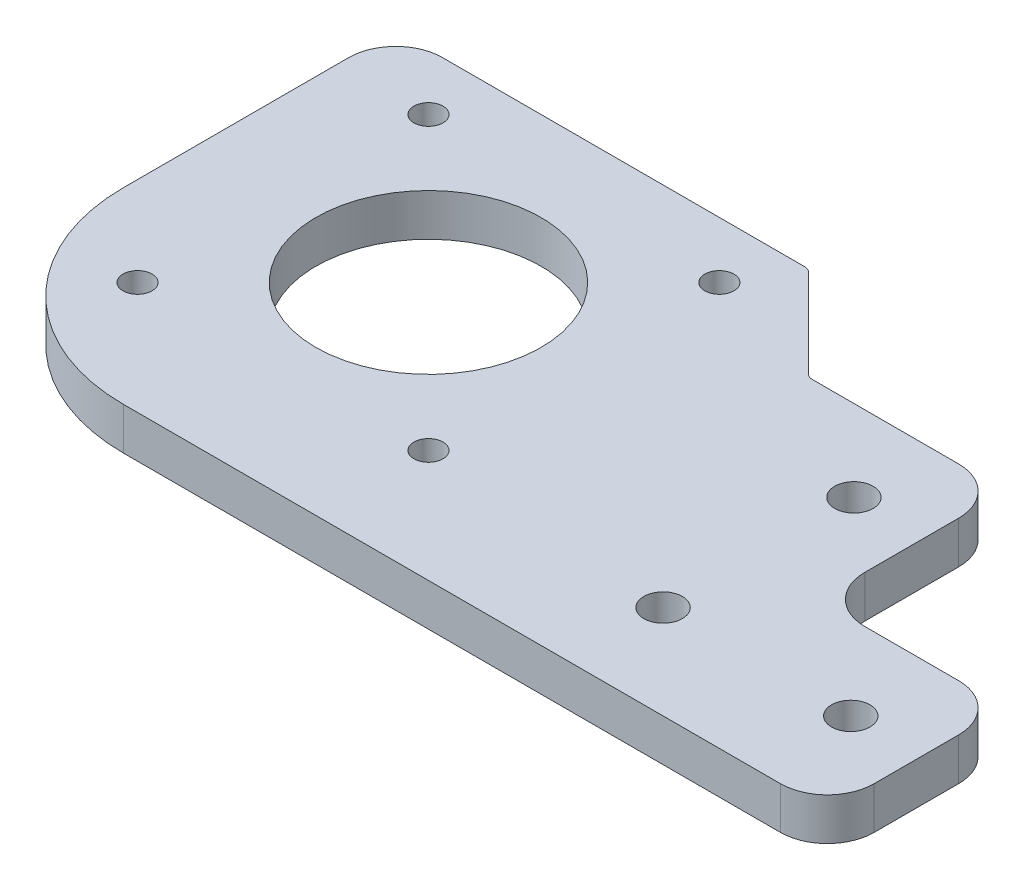
ISO-10303-21;
HEADER;
FILE_DESCRIPTION(('STEP AP214'),'2;1');
FILE_NAME('part.step','',(''),(''),'','','');
FILE_SCHEMA(('AUTOMOTIVE_DESIGN { 1 0 10303 214 1 1 1 1 }'));
ENDSEC;
DATA;
#1=APPLICATION_CONTEXT('core data for automotive mechanical design processes');
#2=APPLICATION_PROTOCOL_DEFINITION('international standard','automotive_design',2000,#1);
#3=PRODUCT_CONTEXT('',#1,'mechanical');
#4=PRODUCT('Part','Part','',(#3));
#5=PRODUCT_RELATED_PRODUCT_CATEGORY('part','',(#4));
#6=PRODUCT_DEFINITION_FORMATION('','',#4);
#7=PRODUCT_DEFINITION_CONTEXT('part definition',#1,'design');
#8=PRODUCT_DEFINITION('design','',#6,#7);
#9=PRODUCT_DEFINITION_SHAPE('','',#8);
#10=(LENGTH_UNIT() NAMED_UNIT(*) SI_UNIT(.MILLI.,.METRE.));
#11=(NAMED_UNIT(*) PLANE_ANGLE_UNIT() SI_UNIT($,.RADIAN.));
#12=(NAMED_UNIT(*) SI_UNIT($,.STERADIAN.) SOLID_ANGLE_UNIT());
#13=UNCERTAINTY_MEASURE_WITH_UNIT(LENGTH_MEASURE(1.E-05),#10,'distance_accuracy_value','');
#14=(GEOMETRIC_REPRESENTATION_CONTEXT(3) GLOBAL_UNCERTAINTY_ASSIGNED_CONTEXT((#13)) GLOBAL_UNIT_ASSIGNED_CONTEXT((#10,
#11,#12)) REPRESENTATION_CONTEXT('',''));
#15=CARTESIAN_POINT('',(0.,0.,0.));
#16=DIRECTION('',(0.,0.,1.));
#17=DIRECTION('',(1.,0.,0.));
#18=AXIS2_PLACEMENT_3D('',#15,#16,#17);
#19=CARTESIAN_POINT('',(0.,4.5,0.));
#20=DIRECTION('',(0.,-1.,0.));
#21=DIRECTION('',(0.,0.,-1.));
#22=AXIS2_PLACEMENT_3D('',#19,#20,#21);
#23=PLANE('',#22);
#24=DIRECTION('',(-0.707106781186548,0.,-0.707106781186547));
#25=VECTOR('',#24,1.);
#26=CARTESIAN_POINT('',(-51.,4.5,-49.));
#27=LINE('',#26,#25);
#28=CARTESIAN_POINT('',(-41.2928932188135,4.5,-39.2928932188134));
#29=VERTEX_POINT('',#28);
#30=CARTESIAN_POINT('',(-50.7071067811866,4.5,-48.7071067811865));
#31=VERTEX_POINT('',#30);
#32=EDGE_CURVE('E262',#29,#31,#27,.T.);
#33=ORIENTED_EDGE('',*,*,#32,.T.);
#34=CARTESIAN_POINT('',(-51.4142135623731,4.5,-48.));
#35=DIRECTION('',(0.,-1.,0.));
#36=DIRECTION('',(0.,0.,-1.));
#37=AXIS2_PLACEMENT_3D('',#34,#35,#36);
#38=CIRCLE('',#37,1.);
#39=CARTESIAN_POINT('',(-51.4142135623731,4.5,-49.));
#40=VERTEX_POINT('',#39);
#41=EDGE_CURVE('E48',#31,#40,#38,.F.);
#42=ORIENTED_EDGE('',*,*,#41,.T.);
#43=DIRECTION('',(-1.,0.,0.));
#44=VECTOR('',#43,1.);
#45=CARTESIAN_POINT('',(-95.,4.5,-49.));
#46=LINE('',#45,#44);
#47=CARTESIAN_POINT('',(-90.,4.5,-49.));
#48=VERTEX_POINT('',#47);
#49=EDGE_CURVE('E266',#40,#48,#46,.T.);
#50=ORIENTED_EDGE('',*,*,#49,.T.);
#51=CARTESIAN_POINT('',(-90.,4.5,-44.));
#52=DIRECTION('',(0.,-1.,0.));
#53=DIRECTION('',(0.,0.,-1.));
#54=AXIS2_PLACEMENT_3D('',#51,#52,#53);
#55=CIRCLE('',#54,5.);
#56=CARTESIAN_POINT('',(-95.,4.5,-44.));
#57=VERTEX_POINT('',#56);
#58=EDGE_CURVE('E211',#48,#57,#55,.F.);
#59=ORIENTED_EDGE('',*,*,#58,.T.);
#60=DIRECTION('',(0.,0.,1.));
#61=VECTOR('',#60,1.);
#62=CARTESIAN_POINT('',(-95.,4.5,0.));
#63=LINE('',#62,#61);
#64=CARTESIAN_POINT('',(-95.,4.5,-20.));
#65=VERTEX_POINT('',#64);
#66=EDGE_CURVE('E268',#57,#65,#63,.T.);
#67=ORIENTED_EDGE('',*,*,#66,.T.);
#68=CARTESIAN_POINT('',(-75.,4.5,-20.));
#69=DIRECTION('',(0.,-1.,0.));
#70=DIRECTION('',(0.,0.,-1.));
#71=AXIS2_PLACEMENT_3D('',#68,#69,#70);
#72=CIRCLE('',#71,20.);
#73=CARTESIAN_POINT('',(-75.,4.5,0.));
#74=VERTEX_POINT('',#73);
#75=EDGE_CURVE('E184',#65,#74,#72,.F.);
#76=ORIENTED_EDGE('',*,*,#75,.T.);
#77=DIRECTION('',(1.,0.,0.));
#78=VECTOR('',#77,1.);
#79=CARTESIAN_POINT('',(0.,4.5,0.));
#80=LINE('',#79,#78);
#81=CARTESIAN_POINT('',(-5.,4.5,0.));
#82=VERTEX_POINT('',#81);
#83=EDGE_CURVE('E166',#74,#82,#80,.T.);
#84=ORIENTED_EDGE('',*,*,#83,.T.);
#85=CARTESIAN_POINT('',(-5.,4.5,-5.));
#86=DIRECTION('',(0.,-1.,0.));
#87=DIRECTION('',(0.,0.,-1.));
#88=AXIS2_PLACEMENT_3D('',#85,#86,#87);
#89=CIRCLE('',#88,5.);
#90=CARTESIAN_POINT('',(0.,4.5,-5.));
#91=VERTEX_POINT('',#90);
#92=EDGE_CURVE('E217',#82,#91,#89,.F.);
#93=ORIENTED_EDGE('',*,*,#92,.T.);
#94=DIRECTION('',(0.,0.,-1.));
#95=VECTOR('',#94,1.);
#96=CARTESIAN_POINT('',(0.,4.5,-19.));
#97=LINE('',#96,#95);
#98=CARTESIAN_POINT('',(0.,4.5,-14.));
#99=VERTEX_POINT('',#98);
#100=EDGE_CURVE('E173',#91,#99,#97,.T.);
#101=ORIENTED_EDGE('',*,*,#100,.T.);
#102=CARTESIAN_POINT('',(-5.,4.5,-14.));
#103=DIRECTION('',(0.,-1.,0.));
#104=DIRECTION('',(0.,0.,-1.));
#105=AXIS2_PLACEMENT_3D('',#102,#103,#104);
#106=CIRCLE('',#105,5.);
#107=CARTESIAN_POINT('',(-5.,4.5,-19.));
#108=VERTEX_POINT('',#107);
#109=EDGE_CURVE('E215',#99,#108,#106,.F.);
#110=ORIENTED_EDGE('',*,*,#109,.T.);
#111=DIRECTION('',(-1.,0.,0.));
#112=VECTOR('',#111,1.);
#113=CARTESIAN_POINT('',(-20.,4.5,-19.));
#114=LINE('',#113,#112);
#115=CARTESIAN_POINT('',(-15.,4.5,-19.));
#116=VERTEX_POINT('',#115);
#117=EDGE_CURVE('E177',#108,#116,#114,.T.);
#118=ORIENTED_EDGE('',*,*,#117,.T.);
#119=CARTESIAN_POINT('',(-15.,4.5,-24.));
#120=DIRECTION('',(0.,-1.,0.));
#121=DIRECTION('',(0.,0.,-1.));
#122=AXIS2_PLACEMENT_3D('',#119,#120,#121);
#123=CIRCLE('',#122,5.);
#124=CARTESIAN_POINT('',(-20.,4.5,-24.));
#125=VERTEX_POINT('',#124);
#126=EDGE_CURVE('E230',#116,#125,#123,.T.);
#127=ORIENTED_EDGE('',*,*,#126,.T.);
#128=DIRECTION('',(0.,0.,-1.));
#129=VECTOR('',#128,1.);
#130=CARTESIAN_POINT('',(-20.,4.5,-39.));
#131=LINE('',#130,#129);
#132=CARTESIAN_POINT('',(-20.,4.5,-34.));
#133=VERTEX_POINT('',#132);
#134=EDGE_CURVE('E270',#125,#133,#131,.T.);
#135=ORIENTED_EDGE('',*,*,#134,.T.);
#136=CARTESIAN_POINT('',(-25.,4.5,-34.));
#137=DIRECTION('',(0.,-1.,0.));
#138=DIRECTION('',(0.,0.,-1.));
#139=AXIS2_PLACEMENT_3D('',#136,#137,#138);
#140=CIRCLE('',#139,5.);
#141=CARTESIAN_POINT('',(-25.,4.5,-39.));
#142=VERTEX_POINT('',#141);
#143=EDGE_CURVE('E213',#133,#142,#140,.F.);
#144=ORIENTED_EDGE('',*,*,#143,.T.);
#145=DIRECTION('',(-1.,0.,0.));
#146=VECTOR('',#145,1.);
#147=CARTESIAN_POINT('',(-41.,4.5,-39.));
#148=LINE('',#147,#146);
#149=CARTESIAN_POINT('',(-40.5857864376269,4.5,-39.));
#150=VERTEX_POINT('',#149);
#151=EDGE_CURVE('E263',#142,#150,#148,.T.);
#152=ORIENTED_EDGE('',*,*,#151,.T.);
#153=CARTESIAN_POINT('',(-40.5857864376269,4.5,-40.));
#154=DIRECTION('',(0.,-1.,0.));
#155=DIRECTION('',(0.,0.,-1.));
#156=AXIS2_PLACEMENT_3D('',#153,#154,#155);
#157=CIRCLE('',#156,1.);
#158=EDGE_CURVE('E11',#150,#29,#157,.T.);
#159=ORIENTED_EDGE('',*,*,#158,.T.);
#160=EDGE_LOOP('',(#33,#42,#50,#59,#67,#76,#84,#93,#101,#110,#118,#127,#135,#144,#152,#159));
#161=FACE_BOUND('',#160,.T.);
#162=CARTESIAN_POINT('',(-7.5,4.5,-10.));
#163=DIRECTION('',(0.,1.,0.));
#164=DIRECTION('',(0.,0.,1.));
#165=AXIS2_PLACEMENT_3D('',#162,#163,#164);
#166=CIRCLE('',#165,2.05);
#167=CARTESIAN_POINT('',(-7.5,4.5,-7.95));
#168=VERTEX_POINT('',#167);
#169=EDGE_CURVE('E280',#168,#168,#166,.T.);
#170=ORIENTED_EDGE('',*,*,#169,.F.);
#171=EDGE_LOOP('',(#170));
#172=FACE_BOUND('',#171,.T.);
#173=CARTESIAN_POINT('',(-27.5,4.5,-10.));
#174=DIRECTION('',(0.,1.,0.));
#175=DIRECTION('',(0.,0.,1.));
#176=AXIS2_PLACEMENT_3D('',#173,#174,#175);
#177=CIRCLE('',#176,2.05);
#178=CARTESIAN_POINT('',(-27.5,4.5,-7.95));
#179=VERTEX_POINT('',#178);
#180=EDGE_CURVE('E320',#179,#179,#177,.T.);
#181=ORIENTED_EDGE('',*,*,#180,.F.);
#182=EDGE_LOOP('',(#181));
#183=FACE_BOUND('',#182,.T.);
#184=CARTESIAN_POINT('',(-27.5,4.5,-30.3372451274422));
#185=DIRECTION('',(0.,1.,0.));
#186=DIRECTION('',(0.,0.,1.));
#187=AXIS2_PLACEMENT_3D('',#184,#185,#186);
#188=CIRCLE('',#187,2.05);
#189=CARTESIAN_POINT('',(-27.5,4.5,-28.2872451274422));
#190=VERTEX_POINT('',#189);
#191=EDGE_CURVE('E326',#190,#190,#188,.T.);
#192=ORIENTED_EDGE('',*,*,#191,.F.);
#193=EDGE_LOOP('',(#192));
#194=FACE_BOUND('',#193,.T.);
#195=CARTESIAN_POINT('',(-70.,4.5,-27.5));
#196=DIRECTION('',(0.,1.,0.));
#197=DIRECTION('',(0.,0.,1.));
#198=AXIS2_PLACEMENT_3D('',#195,#196,#197);
#199=CIRCLE('',#198,12.);
#200=CARTESIAN_POINT('',(-70.,4.5,-15.5));
#201=VERTEX_POINT('',#200);
#202=EDGE_CURVE('E332',#201,#201,#199,.T.);
#203=ORIENTED_EDGE('',*,*,#202,.F.);
#204=EDGE_LOOP('',(#203));
#205=FACE_BOUND('',#204,.T.);
#206=CARTESIAN_POINT('',(-85.5,4.5,-43.));
#207=DIRECTION('',(0.,1.,0.));
#208=DIRECTION('',(0.,0.,1.));
#209=AXIS2_PLACEMENT_3D('',#206,#207,#208);
#210=CIRCLE('',#209,1.54999999999999);
#211=CARTESIAN_POINT('',(-85.5,4.5,-41.45));
#212=VERTEX_POINT('',#211);
#213=EDGE_CURVE('E338',#212,#212,#210,.T.);
#214=ORIENTED_EDGE('',*,*,#213,.F.);
#215=EDGE_LOOP('',(#214));
#216=FACE_BOUND('',#215,.T.);
#217=CARTESIAN_POINT('',(-54.5,4.5,-43.));
#218=DIRECTION('',(0.,1.,0.));
#219=DIRECTION('',(0.,0.,1.));
#220=AXIS2_PLACEMENT_3D('',#217,#218,#219);
#221=CIRCLE('',#220,1.55);
#222=CARTESIAN_POINT('',(-54.5,4.5,-41.45));
#223=VERTEX_POINT('',#222);
#224=EDGE_CURVE('E344',#223,#223,#221,.T.);
#225=ORIENTED_EDGE('',*,*,#224,.F.);
#226=EDGE_LOOP('',(#225));
#227=FACE_BOUND('',#226,.T.);
#228=CARTESIAN_POINT('',(-85.5,4.5,-12.));
#229=DIRECTION('',(0.,1.,0.));
#230=DIRECTION('',(0.,0.,1.));
#231=AXIS2_PLACEMENT_3D('',#228,#229,#230);
#232=CIRCLE('',#231,1.54999999999999);
#233=CARTESIAN_POINT('',(-85.5,4.5,-10.45));
#234=VERTEX_POINT('',#233);
#235=EDGE_CURVE('E350',#234,#234,#232,.T.);
#236=ORIENTED_EDGE('',*,*,#235,.F.);
#237=EDGE_LOOP('',(#236));
#238=FACE_BOUND('',#237,.T.);
#239=CARTESIAN_POINT('',(-54.5,4.5,-12.));
#240=DIRECTION('',(0.,1.,0.));
#241=DIRECTION('',(0.,0.,1.));
#242=AXIS2_PLACEMENT_3D('',#239,#240,#241);
#243=CIRCLE('',#242,1.55);
#244=CARTESIAN_POINT('',(-54.5,4.5,-10.45));
#245=VERTEX_POINT('',#244);
#246=EDGE_CURVE('E356',#245,#245,#243,.T.);
#247=ORIENTED_EDGE('',*,*,#246,.F.);
#248=EDGE_LOOP('',(#247));
#249=FACE_BOUND('',#248,.T.);
#250=ADVANCED_FACE('F33',(#161,#172,#183,#194,#205,#216,#227,#238,#249),#23,.F.);
#251=CARTESIAN_POINT('',(0.,0.,0.));
#252=DIRECTION('',(0.,-1.,0.));
#253=DIRECTION('',(0.,0.,-1.));
#254=AXIS2_PLACEMENT_3D('',#251,#252,#253);
#255=PLANE('',#254);
#256=CARTESIAN_POINT('',(-85.5,0.,-12.));
#257=DIRECTION('',(0.,1.,0.));
#258=DIRECTION('',(0.,0.,1.));
#259=AXIS2_PLACEMENT_3D('',#256,#257,#258);
#260=CIRCLE('',#259,1.54999999999999);
#261=CARTESIAN_POINT('',(-85.5,0.,-10.45));
#262=VERTEX_POINT('',#261);
#263=EDGE_CURVE('E353',#262,#262,#260,.T.);
#264=ORIENTED_EDGE('',*,*,#263,.T.);
#265=EDGE_LOOP('',(#264));
#266=FACE_BOUND('',#265,.T.);
#267=CARTESIAN_POINT('',(-85.5,0.,-43.));
#268=DIRECTION('',(0.,1.,0.));
#269=DIRECTION('',(0.,0.,1.));
#270=AXIS2_PLACEMENT_3D('',#267,#268,#269);
#271=CIRCLE('',#270,1.54999999999999);
#272=CARTESIAN_POINT('',(-85.5,0.,-41.45));
#273=VERTEX_POINT('',#272);
#274=EDGE_CURVE('E341',#273,#273,#271,.T.);
#275=ORIENTED_EDGE('',*,*,#274,.T.);
#276=EDGE_LOOP('',(#275));
#277=FACE_BOUND('',#276,.T.);
#278=CARTESIAN_POINT('',(-27.5,0.,-30.3372451274422));
#279=DIRECTION('',(0.,1.,0.));
#280=DIRECTION('',(0.,0.,1.));
#281=AXIS2_PLACEMENT_3D('',#278,#279,#280);
#282=CIRCLE('',#281,2.05);
#283=CARTESIAN_POINT('',(-27.5,0.,-28.2872451274422));
#284=VERTEX_POINT('',#283);
#285=EDGE_CURVE('E329',#284,#284,#282,.T.);
#286=ORIENTED_EDGE('',*,*,#285,.T.);
#287=EDGE_LOOP('',(#286));
#288=FACE_BOUND('',#287,.T.);
#289=CARTESIAN_POINT('',(-7.5,0.,-10.));
#290=DIRECTION('',(0.,1.,0.));
#291=DIRECTION('',(0.,0.,1.));
#292=AXIS2_PLACEMENT_3D('',#289,#290,#291);
#293=CIRCLE('',#292,2.05);
#294=CARTESIAN_POINT('',(-7.5,0.,-7.95));
#295=VERTEX_POINT('',#294);
#296=EDGE_CURVE('E317',#295,#295,#293,.T.);
#297=ORIENTED_EDGE('',*,*,#296,.T.);
#298=EDGE_LOOP('',(#297));
#299=FACE_BOUND('',#298,.T.);
#300=DIRECTION('',(-1.,0.,0.));
#301=VECTOR('',#300,1.);
#302=CARTESIAN_POINT('',(-95.,0.,-49.));
#303=LINE('',#302,#301);
#304=CARTESIAN_POINT('',(-51.4142135623731,0.,-49.));
#305=VERTEX_POINT('',#304);
#306=CARTESIAN_POINT('',(-90.,0.,-49.));
#307=VERTEX_POINT('',#306);
#308=EDGE_CURVE('E179',#305,#307,#303,.T.);
#309=ORIENTED_EDGE('',*,*,#308,.F.);
#310=CARTESIAN_POINT('',(-51.4142135623731,0.,-48.));
#311=DIRECTION('',(0.,-1.,0.));
#312=DIRECTION('',(0.,0.,-1.));
#313=AXIS2_PLACEMENT_3D('',#310,#311,#312);
#314=CIRCLE('',#313,1.);
#315=CARTESIAN_POINT('',(-50.7071067811866,0.,-48.7071067811865));
#316=VERTEX_POINT('',#315);
#317=EDGE_CURVE('E56',#305,#316,#314,.T.);
#318=ORIENTED_EDGE('',*,*,#317,.T.);
#319=DIRECTION('',(-0.707106781186548,0.,-0.707106781186547));
#320=VECTOR('',#319,1.);
#321=CARTESIAN_POINT('',(-51.,0.,-49.));
#322=LINE('',#321,#320);
#323=CARTESIAN_POINT('',(-41.2928932188135,0.,-39.2928932188134));
#324=VERTEX_POINT('',#323);
#325=EDGE_CURVE('E247',#324,#316,#322,.T.);
#326=ORIENTED_EDGE('',*,*,#325,.F.);
#327=CARTESIAN_POINT('',(-40.5857864376269,0.,-40.));
#328=DIRECTION('',(0.,-1.,0.));
#329=DIRECTION('',(0.,0.,-1.));
#330=AXIS2_PLACEMENT_3D('',#327,#328,#329);
#331=CIRCLE('',#330,1.);
#332=CARTESIAN_POINT('',(-40.5857864376269,0.,-39.));
#333=VERTEX_POINT('',#332);
#334=EDGE_CURVE('E41',#324,#333,#331,.F.);
#335=ORIENTED_EDGE('',*,*,#334,.T.);
#336=DIRECTION('',(-1.,0.,0.));
#337=VECTOR('',#336,1.);
#338=CARTESIAN_POINT('',(-41.,0.,-39.));
#339=LINE('',#338,#337);
#340=CARTESIAN_POINT('',(-25.,0.,-39.));
#341=VERTEX_POINT('',#340);
#342=EDGE_CURVE('E245',#341,#333,#339,.T.);
#343=ORIENTED_EDGE('',*,*,#342,.F.);
#344=CARTESIAN_POINT('',(-25.,0.,-34.));
#345=DIRECTION('',(0.,-1.,0.));
#346=DIRECTION('',(0.,0.,-1.));
#347=AXIS2_PLACEMENT_3D('',#344,#345,#346);
#348=CIRCLE('',#347,5.);
#349=CARTESIAN_POINT('',(-20.,0.,-34.));
#350=VERTEX_POINT('',#349);
#351=EDGE_CURVE('E204',#341,#350,#348,.T.);
#352=ORIENTED_EDGE('',*,*,#351,.T.);
#353=DIRECTION('',(0.,0.,-1.));
#354=VECTOR('',#353,1.);
#355=CARTESIAN_POINT('',(-20.,0.,-39.));
#356=LINE('',#355,#354);
#357=CARTESIAN_POINT('',(-20.,0.,-24.));
#358=VERTEX_POINT('',#357);
#359=EDGE_CURVE('E256',#358,#350,#356,.T.);
#360=ORIENTED_EDGE('',*,*,#359,.F.);
#361=CARTESIAN_POINT('',(-15.,0.,-24.));
#362=DIRECTION('',(0.,-1.,0.));
#363=DIRECTION('',(0.,0.,-1.));
#364=AXIS2_PLACEMENT_3D('',#361,#362,#363);
#365=CIRCLE('',#364,5.);
#366=CARTESIAN_POINT('',(-15.,0.,-19.));
#367=VERTEX_POINT('',#366);
#368=EDGE_CURVE('E228',#358,#367,#365,.F.);
#369=ORIENTED_EDGE('',*,*,#368,.T.);
#370=DIRECTION('',(-1.,0.,0.));
#371=VECTOR('',#370,1.);
#372=CARTESIAN_POINT('',(-20.,0.,-19.));
#373=LINE('',#372,#371);
#374=CARTESIAN_POINT('',(-5.,0.,-19.));
#375=VERTEX_POINT('',#374);
#376=EDGE_CURVE('E279',#375,#367,#373,.T.);
#377=ORIENTED_EDGE('',*,*,#376,.F.);
#378=CARTESIAN_POINT('',(-5.,0.,-14.));
#379=DIRECTION('',(0.,-1.,0.));
#380=DIRECTION('',(0.,0.,-1.));
#381=AXIS2_PLACEMENT_3D('',#378,#379,#380);
#382=CIRCLE('',#381,5.);
#383=CARTESIAN_POINT('',(0.,0.,-14.));
#384=VERTEX_POINT('',#383);
#385=EDGE_CURVE('E206',#375,#384,#382,.T.);
#386=ORIENTED_EDGE('',*,*,#385,.T.);
#387=DIRECTION('',(0.,0.,-1.));
#388=VECTOR('',#387,1.);
#389=CARTESIAN_POINT('',(0.,0.,-19.));
#390=LINE('',#389,#388);
#391=CARTESIAN_POINT('',(0.,0.,-5.));
#392=VERTEX_POINT('',#391);
#393=EDGE_CURVE('E276',#392,#384,#390,.T.);
#394=ORIENTED_EDGE('',*,*,#393,.F.);
#395=CARTESIAN_POINT('',(-5.,0.,-5.));
#396=DIRECTION('',(0.,-1.,0.));
#397=DIRECTION('',(0.,0.,-1.));
#398=AXIS2_PLACEMENT_3D('',#395,#396,#397);
#399=CIRCLE('',#398,5.);
#400=CARTESIAN_POINT('',(-5.,0.,0.));
#401=VERTEX_POINT('',#400);
#402=EDGE_CURVE('E172',#392,#401,#399,.T.);
#403=ORIENTED_EDGE('',*,*,#402,.T.);
#404=DIRECTION('',(1.,0.,0.));
#405=VECTOR('',#404,1.);
#406=CARTESIAN_POINT('',(0.,0.,0.));
#407=LINE('',#406,#405);
#408=CARTESIAN_POINT('',(-75.,0.,0.));
#409=VERTEX_POINT('',#408);
#410=EDGE_CURVE('E163',#409,#401,#407,.T.);
#411=ORIENTED_EDGE('',*,*,#410,.F.);
#412=CARTESIAN_POINT('',(-75.,0.,-20.));
#413=DIRECTION('',(0.,-1.,0.));
#414=DIRECTION('',(0.,0.,-1.));
#415=AXIS2_PLACEMENT_3D('',#412,#413,#414);
#416=CIRCLE('',#415,20.);
#417=CARTESIAN_POINT('',(-95.,0.,-20.));
#418=VERTEX_POINT('',#417);
#419=EDGE_CURVE('E148',#409,#418,#416,.T.);
#420=ORIENTED_EDGE('',*,*,#419,.T.);
#421=DIRECTION('',(0.,0.,1.));
#422=VECTOR('',#421,1.);
#423=CARTESIAN_POINT('',(-95.,0.,0.));
#424=LINE('',#423,#422);
#425=CARTESIAN_POINT('',(-95.,0.,-44.));
#426=VERTEX_POINT('',#425);
#427=EDGE_CURVE('E174',#426,#418,#424,.T.);
#428=ORIENTED_EDGE('',*,*,#427,.F.);
#429=CARTESIAN_POINT('',(-90.,0.,-44.));
#430=DIRECTION('',(0.,-1.,0.));
#431=DIRECTION('',(0.,0.,-1.));
#432=AXIS2_PLACEMENT_3D('',#429,#430,#431);
#433=CIRCLE('',#432,5.);
#434=EDGE_CURVE('E201',#426,#307,#433,.T.);
#435=ORIENTED_EDGE('',*,*,#434,.T.);
#436=EDGE_LOOP('',(#309,#318,#326,#335,#343,#352,#360,#369,#377,#386,#394,#403,#411,#420,#428,#435));
#437=FACE_BOUND('',#436,.T.);
#438=CARTESIAN_POINT('',(-27.5,0.,-10.));
#439=DIRECTION('',(0.,1.,0.));
#440=DIRECTION('',(0.,0.,1.));
#441=AXIS2_PLACEMENT_3D('',#438,#439,#440);
#442=CIRCLE('',#441,2.05);
#443=CARTESIAN_POINT('',(-27.5,0.,-7.95));
#444=VERTEX_POINT('',#443);
#445=EDGE_CURVE('E323',#444,#444,#442,.T.);
#446=ORIENTED_EDGE('',*,*,#445,.T.);
#447=EDGE_LOOP('',(#446));
#448=FACE_BOUND('',#447,.T.);
#449=CARTESIAN_POINT('',(-70.,0.,-27.5));
#450=DIRECTION('',(0.,1.,0.));
#451=DIRECTION('',(0.,0.,1.));
#452=AXIS2_PLACEMENT_3D('',#449,#450,#451);
#453=CIRCLE('',#452,12.);
#454=CARTESIAN_POINT('',(-70.,0.,-15.5));
#455=VERTEX_POINT('',#454);
#456=EDGE_CURVE('E335',#455,#455,#453,.T.);
#457=ORIENTED_EDGE('',*,*,#456,.T.);
#458=EDGE_LOOP('',(#457));
#459=FACE_BOUND('',#458,.T.);
#460=CARTESIAN_POINT('',(-54.5,0.,-43.));
#461=DIRECTION('',(0.,1.,0.));
#462=DIRECTION('',(0.,0.,1.));
#463=AXIS2_PLACEMENT_3D('',#460,#461,#462);
#464=CIRCLE('',#463,1.55);
#465=CARTESIAN_POINT('',(-54.5,0.,-41.45));
#466=VERTEX_POINT('',#465);
#467=EDGE_CURVE('E347',#466,#466,#464,.T.);
#468=ORIENTED_EDGE('',*,*,#467,.T.);
#469=EDGE_LOOP('',(#468));
#470=FACE_BOUND('',#469,.T.);
#471=CARTESIAN_POINT('',(-54.5,0.,-12.));
#472=DIRECTION('',(0.,1.,0.));
#473=DIRECTION('',(0.,0.,1.));
#474=AXIS2_PLACEMENT_3D('',#471,#472,#473);
#475=CIRCLE('',#474,1.55);
#476=CARTESIAN_POINT('',(-54.5,0.,-10.45));
#477=VERTEX_POINT('',#476);
#478=EDGE_CURVE('E359',#477,#477,#475,.T.);
#479=ORIENTED_EDGE('',*,*,#478,.T.);
#480=EDGE_LOOP('',(#479));
#481=FACE_BOUND('',#480,.T.);
#482=ADVANCED_FACE('F169',(#266,#277,#288,#299,#437,#448,#459,#470,#481),#255,.T.);
#483=CARTESIAN_POINT('',(0.,4.5,-19.));
#484=DIRECTION('',(-1.,0.,0.));
#485=DIRECTION('',(0.,0.,1.));
#486=AXIS2_PLACEMENT_3D('',#483,#484,#485);
#487=PLANE('',#486);
#488=ORIENTED_EDGE('',*,*,#100,.F.);
#489=DIRECTION('',(0.,-1.,0.));
#490=VECTOR('',#489,1.);
#491=CARTESIAN_POINT('',(0.,4.5,-5.));
#492=LINE('',#491,#490);
#493=EDGE_CURVE('E198',#91,#392,#492,.T.);
#494=ORIENTED_EDGE('',*,*,#493,.T.);
#495=ORIENTED_EDGE('',*,*,#393,.T.);
#496=DIRECTION('',(0.,-1.,0.));
#497=VECTOR('',#496,1.);
#498=CARTESIAN_POINT('',(0.,4.5,-14.));
#499=LINE('',#498,#497);
#500=EDGE_CURVE('E196',#384,#99,#499,.F.);
#501=ORIENTED_EDGE('',*,*,#500,.T.);
#502=EDGE_LOOP('',(#488,#494,#495,#501));
#503=FACE_BOUND('',#502,.T.);
#504=ADVANCED_FACE('F301',(#503),#487,.F.);
#505=CARTESIAN_POINT('',(-20.,4.5,-19.));
#506=DIRECTION('',(0.,0.,1.));
#507=DIRECTION('',(1.,0.,0.));
#508=AXIS2_PLACEMENT_3D('',#505,#506,#507);
#509=PLANE('',#508);
#510=ORIENTED_EDGE('',*,*,#376,.T.);
#511=DIRECTION('',(0.,-1.,0.));
#512=VECTOR('',#511,1.);
#513=CARTESIAN_POINT('',(-15.,4.5,-19.));
#514=LINE('',#513,#512);
#515=EDGE_CURVE('E194',#367,#116,#514,.F.);
#516=ORIENTED_EDGE('',*,*,#515,.T.);
#517=ORIENTED_EDGE('',*,*,#117,.F.);
#518=DIRECTION('',(0.,-1.,0.));
#519=VECTOR('',#518,1.);
#520=CARTESIAN_POINT('',(-5.,4.5,-19.));
#521=LINE('',#520,#519);
#522=EDGE_CURVE('E191',#108,#375,#521,.T.);
#523=ORIENTED_EDGE('',*,*,#522,.T.);
#524=EDGE_LOOP('',(#510,#516,#517,#523));
#525=FACE_BOUND('',#524,.T.);
#526=ADVANCED_FACE('F310',(#525),#509,.F.);
#527=CARTESIAN_POINT('',(-20.,4.5,-39.));
#528=DIRECTION('',(-1.,0.,0.));
#529=DIRECTION('',(0.,0.,1.));
#530=AXIS2_PLACEMENT_3D('',#527,#528,#529);
#531=PLANE('',#530);
#532=ORIENTED_EDGE('',*,*,#134,.F.);
#533=DIRECTION('',(0.,-1.,0.));
#534=VECTOR('',#533,1.);
#535=CARTESIAN_POINT('',(-20.,0.,-24.));
#536=LINE('',#535,#534);
#537=EDGE_CURVE('E188',#125,#358,#536,.T.);
#538=ORIENTED_EDGE('',*,*,#537,.T.);
#539=ORIENTED_EDGE('',*,*,#359,.T.);
#540=DIRECTION('',(0.,-1.,0.));
#541=VECTOR('',#540,1.);
#542=CARTESIAN_POINT('',(-20.,4.5,-34.));
#543=LINE('',#542,#541);
#544=EDGE_CURVE('E186',#350,#133,#543,.F.);
#545=ORIENTED_EDGE('',*,*,#544,.T.);
#546=EDGE_LOOP('',(#532,#538,#539,#545));
#547=FACE_BOUND('',#546,.T.);
#548=ADVANCED_FACE('F389',(#547),#531,.F.);
#549=CARTESIAN_POINT('',(-41.,4.5,-39.));
#550=DIRECTION('',(0.,0.,1.));
#551=DIRECTION('',(1.,0.,0.));
#552=AXIS2_PLACEMENT_3D('',#549,#550,#551);
#553=PLANE('',#552);
#554=ORIENTED_EDGE('',*,*,#342,.T.);
#555=DIRECTION('',(0.,-1.,0.));
#556=VECTOR('',#555,1.);
#557=CARTESIAN_POINT('',(-40.5857864376269,4.5,-39.));
#558=LINE('',#557,#556);
#559=EDGE_CURVE('E237',#333,#150,#558,.F.);
#560=ORIENTED_EDGE('',*,*,#559,.T.);
#561=ORIENTED_EDGE('',*,*,#151,.F.);
#562=DIRECTION('',(0.,-1.,0.));
#563=VECTOR('',#562,1.);
#564=CARTESIAN_POINT('',(-25.,4.5,-39.));
#565=LINE('',#564,#563);
#566=EDGE_CURVE('E219',#142,#341,#565,.T.);
#567=ORIENTED_EDGE('',*,*,#566,.T.);
#568=EDGE_LOOP('',(#554,#560,#561,#567));
#569=FACE_BOUND('',#568,.T.);
#570=ADVANCED_FACE('F252',(#569),#553,.F.);
#571=CARTESIAN_POINT('',(-51.,4.5,-49.));
#572=DIRECTION('',(-0.707106781186547,0.,0.707106781186548));
#573=DIRECTION('',(0.707106781186548,0.,0.707106781186547));
#574=AXIS2_PLACEMENT_3D('',#571,#572,#573);
#575=PLANE('',#574);
#576=ORIENTED_EDGE('',*,*,#32,.F.);
#577=DIRECTION('',(0.,-1.,0.));
#578=VECTOR('',#577,1.);
#579=CARTESIAN_POINT('',(-41.2928932188135,0.,-39.2928932188134));
#580=LINE('',#579,#578);
#581=EDGE_CURVE('E234',#29,#324,#580,.T.);
#582=ORIENTED_EDGE('',*,*,#581,.T.);
#583=ORIENTED_EDGE('',*,*,#325,.T.);
#584=DIRECTION('',(0.,-1.,0.));
#585=VECTOR('',#584,1.);
#586=CARTESIAN_POINT('',(-50.7071067811866,4.5,-48.7071067811865));
#587=LINE('',#586,#585);
#588=EDGE_CURVE('E232',#316,#31,#587,.F.);
#589=ORIENTED_EDGE('',*,*,#588,.T.);
#590=EDGE_LOOP('',(#576,#582,#583,#589));
#591=FACE_BOUND('',#590,.T.);
#592=ADVANCED_FACE('F265',(#591),#575,.F.);
#593=CARTESIAN_POINT('',(-95.,4.5,-49.));
#594=DIRECTION('',(0.,0.,1.));
#595=DIRECTION('',(1.,0.,0.));
#596=AXIS2_PLACEMENT_3D('',#593,#594,#595);
#597=PLANE('',#596);
#598=ORIENTED_EDGE('',*,*,#49,.F.);
#599=DIRECTION('',(0.,-1.,0.));
#600=VECTOR('',#599,1.);
#601=CARTESIAN_POINT('',(-51.4142135623731,4.5,-49.));
#602=LINE('',#601,#600);
#603=EDGE_CURVE('E239',#40,#305,#602,.T.);
#604=ORIENTED_EDGE('',*,*,#603,.T.);
#605=ORIENTED_EDGE('',*,*,#308,.T.);
#606=DIRECTION('',(0.,-1.,0.));
#607=VECTOR('',#606,1.);
#608=CARTESIAN_POINT('',(-90.,4.5,-49.));
#609=LINE('',#608,#607);
#610=EDGE_CURVE('E225',#307,#48,#609,.F.);
#611=ORIENTED_EDGE('',*,*,#610,.T.);
#612=EDGE_LOOP('',(#598,#604,#605,#611));
#613=FACE_BOUND('',#612,.T.);
#614=ADVANCED_FACE('F286',(#613),#597,.F.);
#615=CARTESIAN_POINT('',(-95.,4.5,0.));
#616=DIRECTION('',(1.,0.,0.));
#617=DIRECTION('',(0.,0.,-1.));
#618=AXIS2_PLACEMENT_3D('',#615,#616,#617);
#619=PLANE('',#618);
#620=ORIENTED_EDGE('',*,*,#66,.F.);
#621=DIRECTION('',(0.,-1.,0.));
#622=VECTOR('',#621,1.);
#623=CARTESIAN_POINT('',(-95.,4.5,-44.));
#624=LINE('',#623,#622);
#625=EDGE_CURVE('E222',#57,#426,#624,.T.);
#626=ORIENTED_EDGE('',*,*,#625,.T.);
#627=ORIENTED_EDGE('',*,*,#427,.T.);
#628=DIRECTION('',(0.,-1.,0.));
#629=VECTOR('',#628,1.);
#630=CARTESIAN_POINT('',(-95.,4.5,-20.));
#631=LINE('',#630,#629);
#632=EDGE_CURVE('E154',#418,#65,#631,.F.);
#633=ORIENTED_EDGE('',*,*,#632,.T.);
#634=EDGE_LOOP('',(#620,#626,#627,#633));
#635=FACE_BOUND('',#634,.T.);
#636=ADVANCED_FACE('F294',(#635),#619,.F.);
#637=CARTESIAN_POINT('',(0.,4.5,0.));
#638=DIRECTION('',(0.,0.,-1.));
#639=DIRECTION('',(-1.,0.,0.));
#640=AXIS2_PLACEMENT_3D('',#637,#638,#639);
#641=PLANE('',#640);
#642=ORIENTED_EDGE('',*,*,#410,.T.);
#643=DIRECTION('',(0.,-1.,0.));
#644=VECTOR('',#643,1.);
#645=CARTESIAN_POINT('',(-5.,4.5,0.));
#646=LINE('',#645,#644);
#647=EDGE_CURVE('E209',#401,#82,#646,.F.);
#648=ORIENTED_EDGE('',*,*,#647,.T.);
#649=ORIENTED_EDGE('',*,*,#83,.F.);
#650=DIRECTION('',(0.,-1.,0.));
#651=VECTOR('',#650,1.);
#652=CARTESIAN_POINT('',(-75.,4.5,0.));
#653=LINE('',#652,#651);
#654=EDGE_CURVE('E152',#74,#409,#653,.T.);
#655=ORIENTED_EDGE('',*,*,#654,.T.);
#656=EDGE_LOOP('',(#642,#648,#649,#655));
#657=FACE_BOUND('',#656,.T.);
#658=ADVANCED_FACE('F162',(#657),#641,.F.);
#659=CARTESIAN_POINT('',(-7.5,4.5,-10.));
#660=DIRECTION('',(0.,-1.,0.));
#661=DIRECTION('',(0.,0.,-1.));
#662=AXIS2_PLACEMENT_3D('',#659,#660,#661);
#663=CYLINDRICAL_SURFACE('',#662,2.05);
#664=ORIENTED_EDGE('',*,*,#169,.T.);
#665=EDGE_LOOP('',(#664));
#666=FACE_BOUND('',#665,.T.);
#667=ORIENTED_EDGE('',*,*,#296,.F.);
#668=EDGE_LOOP('',(#667));
#669=FACE_BOUND('',#668,.T.);
#670=ADVANCED_FACE('F376',(#666,#669),#663,.F.);
#671=CARTESIAN_POINT('',(-27.5,4.5,-10.));
#672=DIRECTION('',(0.,-1.,0.));
#673=DIRECTION('',(0.,0.,-1.));
#674=AXIS2_PLACEMENT_3D('',#671,#672,#673);
#675=CYLINDRICAL_SURFACE('',#674,2.05);
#676=ORIENTED_EDGE('',*,*,#180,.T.);
#677=EDGE_LOOP('',(#676));
#678=FACE_BOUND('',#677,.T.);
#679=ORIENTED_EDGE('',*,*,#445,.F.);
#680=EDGE_LOOP('',(#679));
#681=FACE_BOUND('',#680,.T.);
#682=ADVANCED_FACE('F576',(#678,#681),#675,.F.);
#683=CARTESIAN_POINT('',(-27.5,4.5,-30.3372451274422));
#684=DIRECTION('',(0.,-1.,0.));
#685=DIRECTION('',(0.,0.,-1.));
#686=AXIS2_PLACEMENT_3D('',#683,#684,#685);
#687=CYLINDRICAL_SURFACE('',#686,2.05);
#688=ORIENTED_EDGE('',*,*,#191,.T.);
#689=EDGE_LOOP('',(#688));
#690=FACE_BOUND('',#689,.T.);
#691=ORIENTED_EDGE('',*,*,#285,.F.);
#692=EDGE_LOOP('',(#691));
#693=FACE_BOUND('',#692,.T.);
#694=ADVANCED_FACE('F566',(#690,#693),#687,.F.);
#695=CARTESIAN_POINT('',(-70.,4.5,-27.5));
#696=DIRECTION('',(0.,-1.,0.));
#697=DIRECTION('',(0.,0.,-1.));
#698=AXIS2_PLACEMENT_3D('',#695,#696,#697);
#699=CYLINDRICAL_SURFACE('',#698,12.);
#700=ORIENTED_EDGE('',*,*,#202,.T.);
#701=EDGE_LOOP('',(#700));
#702=FACE_BOUND('',#701,.T.);
#703=ORIENTED_EDGE('',*,*,#456,.F.);
#704=EDGE_LOOP('',(#703));
#705=FACE_BOUND('',#704,.T.);
#706=ADVANCED_FACE('F556',(#702,#705),#699,.F.);
#707=CARTESIAN_POINT('',(-85.5,4.5,-43.));
#708=DIRECTION('',(0.,-1.,0.));
#709=DIRECTION('',(0.,0.,-1.));
#710=AXIS2_PLACEMENT_3D('',#707,#708,#709);
#711=CYLINDRICAL_SURFACE('',#710,1.54999999999999);
#712=ORIENTED_EDGE('',*,*,#213,.T.);
#713=EDGE_LOOP('',(#712));
#714=FACE_BOUND('',#713,.T.);
#715=ORIENTED_EDGE('',*,*,#274,.F.);
#716=EDGE_LOOP('',(#715));
#717=FACE_BOUND('',#716,.T.);
#718=ADVANCED_FACE('F546',(#714,#717),#711,.F.);
#719=CARTESIAN_POINT('',(-54.5,4.5,-43.));
#720=DIRECTION('',(0.,-1.,0.));
#721=DIRECTION('',(0.,0.,-1.));
#722=AXIS2_PLACEMENT_3D('',#719,#720,#721);
#723=CYLINDRICAL_SURFACE('',#722,1.55);
#724=ORIENTED_EDGE('',*,*,#224,.T.);
#725=EDGE_LOOP('',(#724));
#726=FACE_BOUND('',#725,.T.);
#727=ORIENTED_EDGE('',*,*,#467,.F.);
#728=EDGE_LOOP('',(#727));
#729=FACE_BOUND('',#728,.T.);
#730=ADVANCED_FACE('F536',(#726,#729),#723,.F.);
#731=CARTESIAN_POINT('',(-85.5,4.5,-12.));
#732=DIRECTION('',(0.,-1.,0.));
#733=DIRECTION('',(0.,0.,-1.));
#734=AXIS2_PLACEMENT_3D('',#731,#732,#733);
#735=CYLINDRICAL_SURFACE('',#734,1.54999999999999);
#736=ORIENTED_EDGE('',*,*,#235,.T.);
#737=EDGE_LOOP('',(#736));
#738=FACE_BOUND('',#737,.T.);
#739=ORIENTED_EDGE('',*,*,#263,.F.);
#740=EDGE_LOOP('',(#739));
#741=FACE_BOUND('',#740,.T.);
#742=ADVANCED_FACE('F527',(#738,#741),#735,.F.);
#743=CARTESIAN_POINT('',(-54.5,4.5,-12.));
#744=DIRECTION('',(0.,-1.,0.));
#745=DIRECTION('',(0.,0.,-1.));
#746=AXIS2_PLACEMENT_3D('',#743,#744,#745);
#747=CYLINDRICAL_SURFACE('',#746,1.55);
#748=ORIENTED_EDGE('',*,*,#246,.T.);
#749=EDGE_LOOP('',(#748));
#750=FACE_BOUND('',#749,.T.);
#751=ORIENTED_EDGE('',*,*,#478,.F.);
#752=EDGE_LOOP('',(#751));
#753=FACE_BOUND('',#752,.T.);
#754=ADVANCED_FACE('F365',(#750,#753),#747,.F.);
#755=CARTESIAN_POINT('',(-75.,4.5,-20.));
#756=DIRECTION('',(0.,-1.,0.));
#757=DIRECTION('',(0.,0.,-1.));
#758=AXIS2_PLACEMENT_3D('',#755,#756,#757);
#759=CYLINDRICAL_SURFACE('',#758,20.);
#760=ORIENTED_EDGE('',*,*,#75,.F.);
#761=ORIENTED_EDGE('',*,*,#632,.F.);
#762=ORIENTED_EDGE('',*,*,#419,.F.);
#763=ORIENTED_EDGE('',*,*,#654,.F.);
#764=EDGE_LOOP('',(#760,#761,#762,#763));
#765=FACE_BOUND('',#764,.T.);
#766=ADVANCED_FACE('F151',(#765),#759,.T.);
#767=CARTESIAN_POINT('',(-15.,4.5,-24.));
#768=DIRECTION('',(0.,1.,0.));
#769=DIRECTION('',(0.,0.,1.));
#770=AXIS2_PLACEMENT_3D('',#767,#768,#769);
#771=CYLINDRICAL_SURFACE('',#770,5.);
#772=ORIENTED_EDGE('',*,*,#126,.F.);
#773=ORIENTED_EDGE('',*,*,#515,.F.);
#774=ORIENTED_EDGE('',*,*,#368,.F.);
#775=ORIENTED_EDGE('',*,*,#537,.F.);
#776=EDGE_LOOP('',(#772,#773,#774,#775));
#777=FACE_BOUND('',#776,.T.);
#778=ADVANCED_FACE('F399',(#777),#771,.F.);
#779=CARTESIAN_POINT('',(-5.,4.5,-5.));
#780=DIRECTION('',(0.,-1.,0.));
#781=DIRECTION('',(0.,0.,-1.));
#782=AXIS2_PLACEMENT_3D('',#779,#780,#781);
#783=CYLINDRICAL_SURFACE('',#782,5.);
#784=ORIENTED_EDGE('',*,*,#92,.F.);
#785=ORIENTED_EDGE('',*,*,#647,.F.);
#786=ORIENTED_EDGE('',*,*,#402,.F.);
#787=ORIENTED_EDGE('',*,*,#493,.F.);
#788=EDGE_LOOP('',(#784,#785,#786,#787));
#789=FACE_BOUND('',#788,.T.);
#790=ADVANCED_FACE('F299',(#789),#783,.T.);
#791=CARTESIAN_POINT('',(-5.,4.5,-14.));
#792=DIRECTION('',(0.,-1.,0.));
#793=DIRECTION('',(0.,0.,-1.));
#794=AXIS2_PLACEMENT_3D('',#791,#792,#793);
#795=CYLINDRICAL_SURFACE('',#794,5.);
#796=ORIENTED_EDGE('',*,*,#109,.F.);
#797=ORIENTED_EDGE('',*,*,#500,.F.);
#798=ORIENTED_EDGE('',*,*,#385,.F.);
#799=ORIENTED_EDGE('',*,*,#522,.F.);
#800=EDGE_LOOP('',(#796,#797,#798,#799));
#801=FACE_BOUND('',#800,.T.);
#802=ADVANCED_FACE('F307',(#801),#795,.T.);
#803=CARTESIAN_POINT('',(-25.,4.5,-34.));
#804=DIRECTION('',(0.,-1.,0.));
#805=DIRECTION('',(0.,0.,-1.));
#806=AXIS2_PLACEMENT_3D('',#803,#804,#805);
#807=CYLINDRICAL_SURFACE('',#806,5.);
#808=ORIENTED_EDGE('',*,*,#143,.F.);
#809=ORIENTED_EDGE('',*,*,#544,.F.);
#810=ORIENTED_EDGE('',*,*,#351,.F.);
#811=ORIENTED_EDGE('',*,*,#566,.F.);
#812=EDGE_LOOP('',(#808,#809,#810,#811));
#813=FACE_BOUND('',#812,.T.);
#814=ADVANCED_FACE('F407',(#813),#807,.T.);
#815=CARTESIAN_POINT('',(-90.,4.5,-44.));
#816=DIRECTION('',(0.,-1.,0.));
#817=DIRECTION('',(0.,0.,-1.));
#818=AXIS2_PLACEMENT_3D('',#815,#816,#817);
#819=CYLINDRICAL_SURFACE('',#818,5.);
#820=ORIENTED_EDGE('',*,*,#58,.F.);
#821=ORIENTED_EDGE('',*,*,#610,.F.);
#822=ORIENTED_EDGE('',*,*,#434,.F.);
#823=ORIENTED_EDGE('',*,*,#625,.F.);
#824=EDGE_LOOP('',(#820,#821,#822,#823));
#825=FACE_BOUND('',#824,.T.);
#826=ADVANCED_FACE('F291',(#825),#819,.T.);
#827=CARTESIAN_POINT('',(-40.5857864376269,4.5,-40.));
#828=DIRECTION('',(0.,1.,0.));
#829=DIRECTION('',(0.,0.,1.));
#830=AXIS2_PLACEMENT_3D('',#827,#828,#829);
#831=CYLINDRICAL_SURFACE('',#830,1.);
#832=ORIENTED_EDGE('',*,*,#158,.F.);
#833=ORIENTED_EDGE('',*,*,#559,.F.);
#834=ORIENTED_EDGE('',*,*,#334,.F.);
#835=ORIENTED_EDGE('',*,*,#581,.F.);
#836=EDGE_LOOP('',(#832,#833,#834,#835));
#837=FACE_BOUND('',#836,.T.);
#838=ADVANCED_FACE('F259',(#837),#831,.F.);
#839=CARTESIAN_POINT('',(-51.4142135623731,4.5,-48.));
#840=DIRECTION('',(0.,-1.,0.));
#841=DIRECTION('',(0.,0.,-1.));
#842=AXIS2_PLACEMENT_3D('',#839,#840,#841);
#843=CYLINDRICAL_SURFACE('',#842,1.);
#844=ORIENTED_EDGE('',*,*,#41,.F.);
#845=ORIENTED_EDGE('',*,*,#588,.F.);
#846=ORIENTED_EDGE('',*,*,#317,.F.);
#847=ORIENTED_EDGE('',*,*,#603,.F.);
#848=EDGE_LOOP('',(#844,#845,#846,#847));
#849=FACE_BOUND('',#848,.T.);
#850=ADVANCED_FACE('F35',(#849),#843,.T.);
#851=CLOSED_SHELL('',(#250,#482,#504,#526,#548,#570,#592,#614,#636,#658,#670,#682,#694,#706,
#718,#730,#742,#754,#766,#778,#790,#802,#814,#826,#838,#850));
#852=MANIFOLD_SOLID_BREP('B2',#851);
#853=ADVANCED_BREP_SHAPE_REPRESENTATION('',(#18,#852),#14);
#854=SHAPE_DEFINITION_REPRESENTATION(#9,#853);
ENDSEC;
END-ISO-10303-21;
